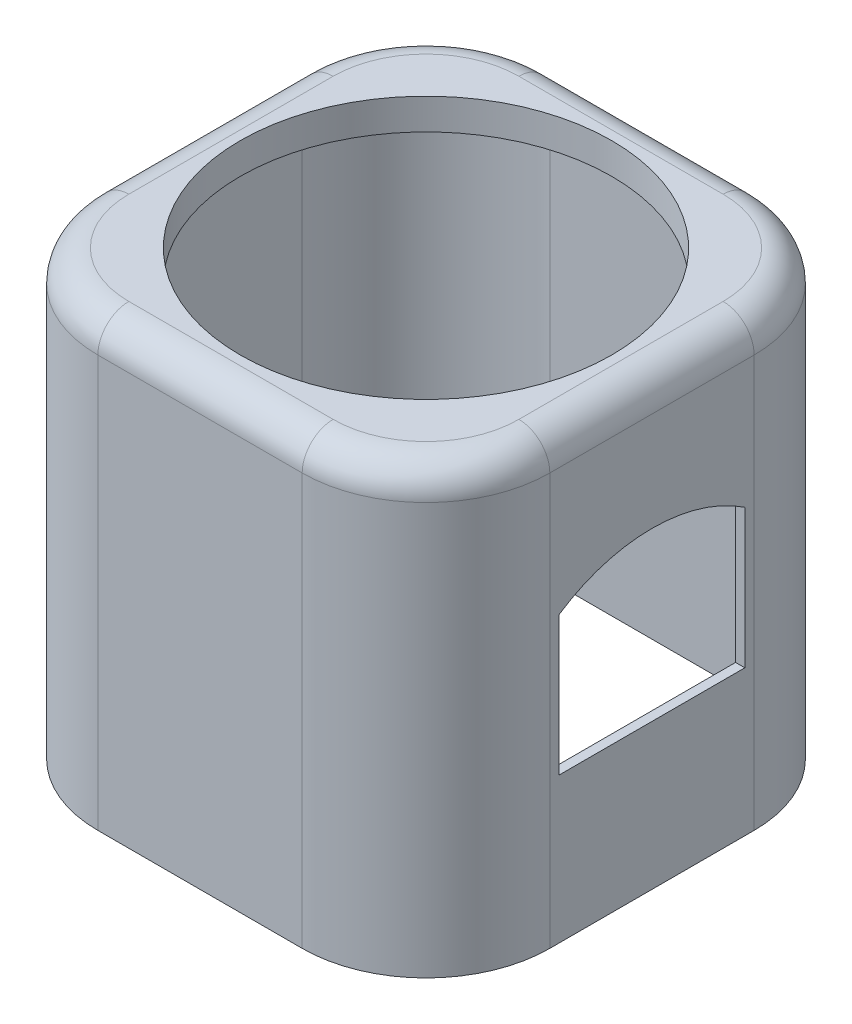
ISO-10303-21;
HEADER;
FILE_DESCRIPTION(('STEP AP214'),'2;1');
FILE_NAME('part.step','',(''),(''),'','','');
FILE_SCHEMA(('AUTOMOTIVE_DESIGN { 1 0 10303 214 1 1 1 1 }'));
ENDSEC;
DATA;
#1=APPLICATION_CONTEXT('core data for automotive mechanical design processes');
#2=APPLICATION_PROTOCOL_DEFINITION('international standard','automotive_design',2000,#1);
#3=PRODUCT_CONTEXT('',#1,'mechanical');
#4=PRODUCT('Part','Part','',(#3));
#5=PRODUCT_RELATED_PRODUCT_CATEGORY('part','',(#4));
#6=PRODUCT_DEFINITION_FORMATION('','',#4);
#7=PRODUCT_DEFINITION_CONTEXT('part definition',#1,'design');
#8=PRODUCT_DEFINITION('design','',#6,#7);
#9=PRODUCT_DEFINITION_SHAPE('','',#8);
#10=(LENGTH_UNIT() NAMED_UNIT(*) SI_UNIT(.MILLI.,.METRE.));
#11=(NAMED_UNIT(*) PLANE_ANGLE_UNIT() SI_UNIT($,.RADIAN.));
#12=(NAMED_UNIT(*) SI_UNIT($,.STERADIAN.) SOLID_ANGLE_UNIT());
#13=UNCERTAINTY_MEASURE_WITH_UNIT(LENGTH_MEASURE(1.E-05),#10,'distance_accuracy_value','');
#14=(GEOMETRIC_REPRESENTATION_CONTEXT(3) GLOBAL_UNCERTAINTY_ASSIGNED_CONTEXT((#13)) GLOBAL_UNIT_ASSIGNED_CONTEXT((#10,
#11,#12)) REPRESENTATION_CONTEXT('',''));
#15=CARTESIAN_POINT('',(0.,0.,0.));
#16=DIRECTION('',(0.,0.,1.));
#17=DIRECTION('',(1.,0.,0.));
#18=AXIS2_PLACEMENT_3D('',#15,#16,#17);
#19=CARTESIAN_POINT('',(73.,250.,-73.));
#20=DIRECTION('',(-1.,0.,0.));
#21=DIRECTION('',(0.,0.,1.));
#22=AXIS2_PLACEMENT_3D('',#19,#20,#21);
#23=PLANE('',#22);
#24=DIRECTION('',(0.,1.,0.));
#25=VECTOR('',#24,1.);
#26=CARTESIAN_POINT('',(73.,250.,33.));
#27=LINE('',#26,#25);
#28=CARTESIAN_POINT('',(73.,240.,33.));
#29=VERTEX_POINT('',#28);
#30=CARTESIAN_POINT('',(73.,107.,33.));
#31=VERTEX_POINT('',#30);
#32=EDGE_CURVE('E274',#29,#31,#27,.F.);
#33=ORIENTED_EDGE('',*,*,#32,.T.);
#34=DIRECTION('',(0.,0.,-1.));
#35=VECTOR('',#34,1.);
#36=CARTESIAN_POINT('',(73.,107.,-73.));
#37=LINE('',#36,#35);
#38=CARTESIAN_POINT('',(73.,107.,-33.));
#39=VERTEX_POINT('',#38);
#40=EDGE_CURVE('E402',#31,#39,#37,.T.);
#41=ORIENTED_EDGE('',*,*,#40,.T.);
#42=DIRECTION('',(0.,1.,0.));
#43=VECTOR('',#42,1.);
#44=CARTESIAN_POINT('',(73.,250.,-33.));
#45=LINE('',#44,#43);
#46=CARTESIAN_POINT('',(73.,240.,-33.));
#47=VERTEX_POINT('',#46);
#48=EDGE_CURVE('E278',#39,#47,#45,.T.);
#49=ORIENTED_EDGE('',*,*,#48,.T.);
#50=DIRECTION('',(0.,0.,-1.));
#51=VECTOR('',#50,1.);
#52=CARTESIAN_POINT('',(73.,240.,33.));
#53=LINE('',#52,#51);
#54=EDGE_CURVE('E318',#47,#29,#53,.F.);
#55=ORIENTED_EDGE('',*,*,#54,.T.);
#56=EDGE_LOOP('',(#33,#41,#49,#55));
#57=FACE_BOUND('',#56,.T.);
#58=DIRECTION('',(0.,0.,-1.));
#59=VECTOR('',#58,1.);
#60=CARTESIAN_POINT('',(73.,154.,-73.));
#61=LINE('',#60,#59);
#62=CARTESIAN_POINT('',(73.,154.,29.9999999999997));
#63=VERTEX_POINT('',#62);
#64=CARTESIAN_POINT('',(73.,154.,-29.9999999999997));
#65=VERTEX_POINT('',#64);
#66=EDGE_CURVE('E229',#63,#65,#61,.T.);
#67=ORIENTED_EDGE('',*,*,#66,.F.);
#68=DIRECTION('',(0.,1.,0.));
#69=VECTOR('',#68,1.);
#70=CARTESIAN_POINT('',(73.,250.,29.9999999999997));
#71=LINE('',#70,#69);
#72=CARTESIAN_POINT('',(73.,198.899888641287,29.9999999999997));
#73=VERTEX_POINT('',#72);
#74=EDGE_CURVE('E475',#63,#73,#71,.T.);
#75=ORIENTED_EDGE('',*,*,#74,.T.);
#76=CARTESIAN_POINT('',(73.,154.,0.));
#77=DIRECTION('',(-1.,0.,0.));
#78=DIRECTION('',(0.,0.,1.));
#79=AXIS2_PLACEMENT_3D('',#76,#77,#78);
#80=CIRCLE('',#79,54.);
#81=CARTESIAN_POINT('',(73.,198.899888641287,-29.9999999999997));
#82=VERTEX_POINT('',#81);
#83=EDGE_CURVE('E472',#73,#82,#80,.T.);
#84=ORIENTED_EDGE('',*,*,#83,.T.);
#85=DIRECTION('',(0.,-1.,0.));
#86=VECTOR('',#85,1.);
#87=CARTESIAN_POINT('',(73.,250.,-29.9999999999997));
#88=LINE('',#87,#86);
#89=EDGE_CURVE('E232',#82,#65,#88,.T.);
#90=ORIENTED_EDGE('',*,*,#89,.T.);
#91=EDGE_LOOP('',(#67,#75,#84,#90));
#92=FACE_BOUND('',#91,.T.);
#93=ADVANCED_FACE('F35',(#57,#92),#23,.F.);
#94=CARTESIAN_POINT('',(70.,240.,29.9999999999997));
#95=DIRECTION('',(1.,0.,0.));
#96=DIRECTION('',(0.,0.,-1.));
#97=AXIS2_PLACEMENT_3D('',#94,#95,#96);
#98=PLANE('',#97);
#99=DIRECTION('',(0.,0.,-1.));
#100=VECTOR('',#99,1.);
#101=CARTESIAN_POINT('',(70.,154.,29.9999999999997));
#102=LINE('',#101,#100);
#103=CARTESIAN_POINT('',(70.,154.,29.9999999999997));
#104=VERTEX_POINT('',#103);
#105=CARTESIAN_POINT('',(70.,154.,-29.9999999999997));
#106=VERTEX_POINT('',#105);
#107=EDGE_CURVE('E226',#104,#106,#102,.T.);
#108=ORIENTED_EDGE('',*,*,#107,.T.);
#109=DIRECTION('',(0.,-1.,0.));
#110=VECTOR('',#109,1.);
#111=CARTESIAN_POINT('',(70.,240.,-29.9999999999997));
#112=LINE('',#111,#110);
#113=CARTESIAN_POINT('',(70.,107.,-29.9999999999997));
#114=VERTEX_POINT('',#113);
#115=EDGE_CURVE('E245',#106,#114,#112,.T.);
#116=ORIENTED_EDGE('',*,*,#115,.T.);
#117=DIRECTION('',(0.,0.,1.));
#118=VECTOR('',#117,1.);
#119=CARTESIAN_POINT('',(70.,107.,29.9999999999997));
#120=LINE('',#119,#118);
#121=CARTESIAN_POINT('',(70.,107.,29.9999999999997));
#122=VERTEX_POINT('',#121);
#123=EDGE_CURVE('E446',#114,#122,#120,.T.);
#124=ORIENTED_EDGE('',*,*,#123,.T.);
#125=DIRECTION('',(0.,-1.,0.));
#126=VECTOR('',#125,1.);
#127=CARTESIAN_POINT('',(70.,240.,29.9999999999997));
#128=LINE('',#127,#126);
#129=EDGE_CURVE('E247',#104,#122,#128,.T.);
#130=ORIENTED_EDGE('',*,*,#129,.F.);
#131=EDGE_LOOP('',(#108,#116,#124,#130));
#132=FACE_BOUND('',#131,.T.);
#133=ADVANCED_FACE('F243',(#132),#98,.F.);
#134=CARTESIAN_POINT('',(-33.,250.,33.));
#135=DIRECTION('',(0.,1.,0.));
#136=DIRECTION('',(0.,0.,1.));
#137=AXIS2_PLACEMENT_3D('',#134,#135,#136);
#138=CYLINDRICAL_SURFACE('',#137,40.);
#139=CARTESIAN_POINT('',(-33.,107.,33.));
#140=DIRECTION('',(0.,1.,0.));
#141=DIRECTION('',(0.,0.,1.));
#142=AXIS2_PLACEMENT_3D('',#139,#140,#141);
#143=CIRCLE('',#142,40.);
#144=CARTESIAN_POINT('',(-33.,107.,73.));
#145=VERTEX_POINT('',#144);
#146=CARTESIAN_POINT('',(-73.,107.,33.));
#147=VERTEX_POINT('',#146);
#148=EDGE_CURVE('E410',#145,#147,#143,.F.);
#149=ORIENTED_EDGE('',*,*,#148,.F.);
#150=DIRECTION('',(0.,1.,0.));
#151=VECTOR('',#150,1.);
#152=CARTESIAN_POINT('',(-33.,250.,73.));
#153=LINE('',#152,#151);
#154=CARTESIAN_POINT('',(-33.,240.,73.));
#155=VERTEX_POINT('',#154);
#156=EDGE_CURVE('E290',#155,#145,#153,.F.);
#157=ORIENTED_EDGE('',*,*,#156,.F.);
#158=CARTESIAN_POINT('',(-33.,240.,33.));
#159=DIRECTION('',(0.,1.,0.));
#160=DIRECTION('',(0.,0.,1.));
#161=AXIS2_PLACEMENT_3D('',#158,#159,#160);
#162=CIRCLE('',#161,40.);
#163=CARTESIAN_POINT('',(-73.,240.,33.));
#164=VERTEX_POINT('',#163);
#165=EDGE_CURVE('E325',#155,#164,#162,.F.);
#166=ORIENTED_EDGE('',*,*,#165,.T.);
#167=DIRECTION('',(0.,1.,0.));
#168=VECTOR('',#167,1.);
#169=CARTESIAN_POINT('',(-73.,250.,33.));
#170=LINE('',#169,#168);
#171=EDGE_CURVE('E288',#147,#164,#170,.T.);
#172=ORIENTED_EDGE('',*,*,#171,.F.);
#173=EDGE_LOOP('',(#149,#157,#166,#172));
#174=FACE_BOUND('',#173,.T.);
#175=ADVANCED_FACE('F567',(#174),#138,.T.);
#176=CARTESIAN_POINT('',(-33.,250.,-33.));
#177=DIRECTION('',(0.,1.,0.));
#178=DIRECTION('',(0.,0.,1.));
#179=AXIS2_PLACEMENT_3D('',#176,#177,#178);
#180=CYLINDRICAL_SURFACE('',#179,40.);
#181=CARTESIAN_POINT('',(-33.,107.,-33.));
#182=DIRECTION('',(0.,1.,0.));
#183=DIRECTION('',(0.,0.,1.));
#184=AXIS2_PLACEMENT_3D('',#181,#182,#183);
#185=CIRCLE('',#184,40.);
#186=CARTESIAN_POINT('',(-73.,107.,-33.));
#187=VERTEX_POINT('',#186);
#188=CARTESIAN_POINT('',(-33.,107.,-73.));
#189=VERTEX_POINT('',#188);
#190=EDGE_CURVE('E400',#187,#189,#185,.F.);
#191=ORIENTED_EDGE('',*,*,#190,.F.);
#192=DIRECTION('',(0.,1.,0.));
#193=VECTOR('',#192,1.);
#194=CARTESIAN_POINT('',(-73.,250.,-33.));
#195=LINE('',#194,#193);
#196=CARTESIAN_POINT('',(-73.,240.,-33.));
#197=VERTEX_POINT('',#196);
#198=EDGE_CURVE('E285',#197,#187,#195,.F.);
#199=ORIENTED_EDGE('',*,*,#198,.F.);
#200=CARTESIAN_POINT('',(-33.,240.,-33.));
#201=DIRECTION('',(0.,1.,0.));
#202=DIRECTION('',(0.,0.,1.));
#203=AXIS2_PLACEMENT_3D('',#200,#201,#202);
#204=CIRCLE('',#203,40.);
#205=CARTESIAN_POINT('',(-33.,240.,-73.));
#206=VERTEX_POINT('',#205);
#207=EDGE_CURVE('E310',#197,#206,#204,.F.);
#208=ORIENTED_EDGE('',*,*,#207,.T.);
#209=DIRECTION('',(0.,1.,0.));
#210=VECTOR('',#209,1.);
#211=CARTESIAN_POINT('',(-33.,250.,-73.));
#212=LINE('',#211,#210);
#213=EDGE_CURVE('E283',#189,#206,#212,.T.);
#214=ORIENTED_EDGE('',*,*,#213,.F.);
#215=EDGE_LOOP('',(#191,#199,#208,#214));
#216=FACE_BOUND('',#215,.T.);
#217=ADVANCED_FACE('F509',(#216),#180,.T.);
#218=CARTESIAN_POINT('',(33.,250.,-33.));
#219=DIRECTION('',(0.,1.,0.));
#220=DIRECTION('',(0.,0.,1.));
#221=AXIS2_PLACEMENT_3D('',#218,#219,#220);
#222=CYLINDRICAL_SURFACE('',#221,40.);
#223=CARTESIAN_POINT('',(33.,107.,-33.));
#224=DIRECTION('',(0.,1.,0.));
#225=DIRECTION('',(0.,0.,1.));
#226=AXIS2_PLACEMENT_3D('',#223,#224,#225);
#227=CIRCLE('',#226,40.);
#228=CARTESIAN_POINT('',(33.,107.,-73.));
#229=VERTEX_POINT('',#228);
#230=EDGE_CURVE('E393',#229,#39,#227,.F.);
#231=ORIENTED_EDGE('',*,*,#230,.F.);
#232=DIRECTION('',(0.,1.,0.));
#233=VECTOR('',#232,1.);
#234=CARTESIAN_POINT('',(33.,250.,-73.));
#235=LINE('',#234,#233);
#236=CARTESIAN_POINT('',(33.,240.,-73.));
#237=VERTEX_POINT('',#236);
#238=EDGE_CURVE('E280',#237,#229,#235,.F.);
#239=ORIENTED_EDGE('',*,*,#238,.F.);
#240=CARTESIAN_POINT('',(33.,240.,-33.));
#241=DIRECTION('',(0.,1.,0.));
#242=DIRECTION('',(0.,0.,1.));
#243=AXIS2_PLACEMENT_3D('',#240,#241,#242);
#244=CIRCLE('',#243,40.);
#245=EDGE_CURVE('E315',#237,#47,#244,.F.);
#246=ORIENTED_EDGE('',*,*,#245,.T.);
#247=ORIENTED_EDGE('',*,*,#48,.F.);
#248=EDGE_LOOP('',(#231,#239,#246,#247));
#249=FACE_BOUND('',#248,.T.);
#250=ADVANCED_FACE('F535',(#249),#222,.T.);
#251=CARTESIAN_POINT('',(33.,250.,33.));
#252=DIRECTION('',(0.,1.,0.));
#253=DIRECTION('',(0.,0.,1.));
#254=AXIS2_PLACEMENT_3D('',#251,#252,#253);
#255=CYLINDRICAL_SURFACE('',#254,40.);
#256=CARTESIAN_POINT('',(33.,107.,33.));
#257=DIRECTION('',(0.,1.,0.));
#258=DIRECTION('',(0.,0.,1.));
#259=AXIS2_PLACEMENT_3D('',#256,#257,#258);
#260=CIRCLE('',#259,40.);
#261=CARTESIAN_POINT('',(33.,107.,73.));
#262=VERTEX_POINT('',#261);
#263=EDGE_CURVE('E408',#31,#262,#260,.F.);
#264=ORIENTED_EDGE('',*,*,#263,.F.);
#265=ORIENTED_EDGE('',*,*,#32,.F.);
#266=CARTESIAN_POINT('',(33.,240.,33.));
#267=DIRECTION('',(0.,1.,0.));
#268=DIRECTION('',(0.,0.,1.));
#269=AXIS2_PLACEMENT_3D('',#266,#267,#268);
#270=CIRCLE('',#269,40.);
#271=CARTESIAN_POINT('',(33.,240.,73.));
#272=VERTEX_POINT('',#271);
#273=EDGE_CURVE('E320',#29,#272,#270,.F.);
#274=ORIENTED_EDGE('',*,*,#273,.T.);
#275=DIRECTION('',(0.,1.,0.));
#276=VECTOR('',#275,1.);
#277=CARTESIAN_POINT('',(33.,250.,73.));
#278=LINE('',#277,#276);
#279=EDGE_CURVE('E272',#262,#272,#278,.T.);
#280=ORIENTED_EDGE('',*,*,#279,.F.);
#281=EDGE_LOOP('',(#264,#265,#274,#280));
#282=FACE_BOUND('',#281,.T.);
#283=ADVANCED_FACE('F551',(#282),#255,.T.);
#284=CARTESIAN_POINT('',(-73.,250.,-73.));
#285=DIRECTION('',(1.,0.,0.));
#286=DIRECTION('',(0.,0.,-1.));
#287=AXIS2_PLACEMENT_3D('',#284,#285,#286);
#288=PLANE('',#287);
#289=DIRECTION('',(0.,0.,-1.));
#290=VECTOR('',#289,1.);
#291=CARTESIAN_POINT('',(-73.,120.,-16.));
#292=LINE('',#291,#290);
#293=CARTESIAN_POINT('',(-73.,120.,16.));
#294=VERTEX_POINT('',#293);
#295=CARTESIAN_POINT('',(-73.,120.,-16.));
#296=VERTEX_POINT('',#295);
#297=EDGE_CURVE('E466',#294,#296,#292,.T.);
#298=ORIENTED_EDGE('',*,*,#297,.F.);
#299=DIRECTION('',(0.,1.,0.));
#300=VECTOR('',#299,1.);
#301=CARTESIAN_POINT('',(-73.,120.,16.));
#302=LINE('',#301,#300);
#303=CARTESIAN_POINT('',(-73.,107.,16.));
#304=VERTEX_POINT('',#303);
#305=EDGE_CURVE('E469',#304,#294,#302,.T.);
#306=ORIENTED_EDGE('',*,*,#305,.F.);
#307=DIRECTION('',(0.,0.,1.));
#308=VECTOR('',#307,1.);
#309=CARTESIAN_POINT('',(-73.,107.,-73.));
#310=LINE('',#309,#308);
#311=EDGE_CURVE('E370',#304,#147,#310,.T.);
#312=ORIENTED_EDGE('',*,*,#311,.T.);
#313=ORIENTED_EDGE('',*,*,#171,.T.);
#314=DIRECTION('',(0.,0.,1.));
#315=VECTOR('',#314,1.);
#316=CARTESIAN_POINT('',(-73.,240.,-33.));
#317=LINE('',#316,#315);
#318=EDGE_CURVE('E328',#164,#197,#317,.F.);
#319=ORIENTED_EDGE('',*,*,#318,.T.);
#320=ORIENTED_EDGE('',*,*,#198,.T.);
#321=CARTESIAN_POINT('',(-73.,107.,-16.));
#322=VERTEX_POINT('',#321);
#323=EDGE_CURVE('E405',#187,#322,#310,.T.);
#324=ORIENTED_EDGE('',*,*,#323,.T.);
#325=DIRECTION('',(0.,-1.,0.));
#326=VECTOR('',#325,1.);
#327=CARTESIAN_POINT('',(-73.,107.,-16.));
#328=LINE('',#327,#326);
#329=EDGE_CURVE('E463',#296,#322,#328,.T.);
#330=ORIENTED_EDGE('',*,*,#329,.F.);
#331=EDGE_LOOP('',(#298,#306,#312,#313,#319,#320,#324,#330));
#332=FACE_BOUND('',#331,.T.);
#333=ADVANCED_FACE('F504',(#332),#288,.F.);
#334=CARTESIAN_POINT('',(-73.,250.,73.));
#335=DIRECTION('',(0.,0.,-1.));
#336=DIRECTION('',(-1.,0.,0.));
#337=AXIS2_PLACEMENT_3D('',#334,#335,#336);
#338=PLANE('',#337);
#339=ORIENTED_EDGE('',*,*,#156,.T.);
#340=DIRECTION('',(1.,0.,0.));
#341=VECTOR('',#340,1.);
#342=CARTESIAN_POINT('',(-73.,107.,73.));
#343=LINE('',#342,#341);
#344=EDGE_CURVE('E412',#145,#262,#343,.T.);
#345=ORIENTED_EDGE('',*,*,#344,.T.);
#346=ORIENTED_EDGE('',*,*,#279,.T.);
#347=DIRECTION('',(1.,0.,0.));
#348=VECTOR('',#347,1.);
#349=CARTESIAN_POINT('',(-33.,240.,73.));
#350=LINE('',#349,#348);
#351=EDGE_CURVE('E323',#272,#155,#350,.F.);
#352=ORIENTED_EDGE('',*,*,#351,.T.);
#353=EDGE_LOOP('',(#339,#345,#346,#352));
#354=FACE_BOUND('',#353,.T.);
#355=ADVANCED_FACE('F564',(#354),#338,.F.);
#356=CARTESIAN_POINT('',(-73.,250.,-73.));
#357=DIRECTION('',(0.,0.,1.));
#358=DIRECTION('',(1.,0.,0.));
#359=AXIS2_PLACEMENT_3D('',#356,#357,#358);
#360=PLANE('',#359);
#361=ORIENTED_EDGE('',*,*,#238,.T.);
#362=DIRECTION('',(-1.,0.,0.));
#363=VECTOR('',#362,1.);
#364=CARTESIAN_POINT('',(-73.,107.,-73.));
#365=LINE('',#364,#363);
#366=EDGE_CURVE('E389',#229,#189,#365,.T.);
#367=ORIENTED_EDGE('',*,*,#366,.T.);
#368=ORIENTED_EDGE('',*,*,#213,.T.);
#369=DIRECTION('',(-1.,0.,0.));
#370=VECTOR('',#369,1.);
#371=CARTESIAN_POINT('',(33.,240.,-73.));
#372=LINE('',#371,#370);
#373=EDGE_CURVE('E313',#206,#237,#372,.F.);
#374=ORIENTED_EDGE('',*,*,#373,.T.);
#375=EDGE_LOOP('',(#361,#367,#368,#374));
#376=FACE_BOUND('',#375,.T.);
#377=ADVANCED_FACE('F531',(#376),#360,.F.);
#378=CARTESIAN_POINT('',(0.,250.,0.));
#379=DIRECTION('',(0.,1.,0.));
#380=DIRECTION('',(0.,0.,1.));
#381=AXIS2_PLACEMENT_3D('',#378,#379,#380);
#382=PLANE('',#381);
#383=CARTESIAN_POINT('',(0.,250.,0.));
#384=DIRECTION('',(0.,1.,0.));
#385=DIRECTION('',(0.,0.,1.));
#386=AXIS2_PLACEMENT_3D('',#383,#384,#385);
#387=CIRCLE('',#386,60.);
#388=CARTESIAN_POINT('',(0.,250.,60.));
#389=VERTEX_POINT('',#388);
#390=EDGE_CURVE('E358',#389,#389,#387,.T.);
#391=ORIENTED_EDGE('',*,*,#390,.F.);
#392=EDGE_LOOP('',(#391));
#393=FACE_BOUND('',#392,.T.);
#394=DIRECTION('',(-1.,0.,0.));
#395=VECTOR('',#394,1.);
#396=CARTESIAN_POINT('',(-33.,250.,-63.));
#397=LINE('',#396,#395);
#398=CARTESIAN_POINT('',(33.,250.,-63.));
#399=VERTEX_POINT('',#398);
#400=CARTESIAN_POINT('',(-33.,250.,-63.));
#401=VERTEX_POINT('',#400);
#402=EDGE_CURVE('E305',#399,#401,#397,.T.);
#403=ORIENTED_EDGE('',*,*,#402,.T.);
#404=CARTESIAN_POINT('',(-33.,250.,-33.));
#405=DIRECTION('',(0.,1.,0.));
#406=DIRECTION('',(0.,0.,1.));
#407=AXIS2_PLACEMENT_3D('',#404,#405,#406);
#408=CIRCLE('',#407,30.);
#409=CARTESIAN_POINT('',(-63.,250.,-33.));
#410=VERTEX_POINT('',#409);
#411=EDGE_CURVE('E307',#401,#410,#408,.T.);
#412=ORIENTED_EDGE('',*,*,#411,.T.);
#413=DIRECTION('',(0.,0.,1.));
#414=VECTOR('',#413,1.);
#415=CARTESIAN_POINT('',(-63.,250.,33.));
#416=LINE('',#415,#414);
#417=CARTESIAN_POINT('',(-63.,250.,33.));
#418=VERTEX_POINT('',#417);
#419=EDGE_CURVE('E293',#410,#418,#416,.T.);
#420=ORIENTED_EDGE('',*,*,#419,.T.);
#421=CARTESIAN_POINT('',(-33.,250.,33.));
#422=DIRECTION('',(0.,1.,0.));
#423=DIRECTION('',(0.,0.,1.));
#424=AXIS2_PLACEMENT_3D('',#421,#422,#423);
#425=CIRCLE('',#424,30.);
#426=CARTESIAN_POINT('',(-33.,250.,63.));
#427=VERTEX_POINT('',#426);
#428=EDGE_CURVE('E295',#418,#427,#425,.T.);
#429=ORIENTED_EDGE('',*,*,#428,.T.);
#430=DIRECTION('',(1.,0.,0.));
#431=VECTOR('',#430,1.);
#432=CARTESIAN_POINT('',(33.,250.,63.));
#433=LINE('',#432,#431);
#434=CARTESIAN_POINT('',(33.,250.,63.));
#435=VERTEX_POINT('',#434);
#436=EDGE_CURVE('E297',#427,#435,#433,.T.);
#437=ORIENTED_EDGE('',*,*,#436,.T.);
#438=CARTESIAN_POINT('',(33.,250.,33.));
#439=DIRECTION('',(0.,1.,0.));
#440=DIRECTION('',(0.,0.,1.));
#441=AXIS2_PLACEMENT_3D('',#438,#439,#440);
#442=CIRCLE('',#441,30.);
#443=CARTESIAN_POINT('',(63.,250.,33.));
#444=VERTEX_POINT('',#443);
#445=EDGE_CURVE('E299',#435,#444,#442,.T.);
#446=ORIENTED_EDGE('',*,*,#445,.T.);
#447=DIRECTION('',(0.,0.,-1.));
#448=VECTOR('',#447,1.);
#449=CARTESIAN_POINT('',(63.,250.,-33.));
#450=LINE('',#449,#448);
#451=CARTESIAN_POINT('',(63.,250.,-33.));
#452=VERTEX_POINT('',#451);
#453=EDGE_CURVE('E301',#444,#452,#450,.T.);
#454=ORIENTED_EDGE('',*,*,#453,.T.);
#455=CARTESIAN_POINT('',(33.,250.,-33.));
#456=DIRECTION('',(0.,1.,0.));
#457=DIRECTION('',(0.,0.,1.));
#458=AXIS2_PLACEMENT_3D('',#455,#456,#457);
#459=CIRCLE('',#458,30.);
#460=EDGE_CURVE('E303',#452,#399,#459,.T.);
#461=ORIENTED_EDGE('',*,*,#460,.T.);
#462=EDGE_LOOP('',(#403,#412,#420,#429,#437,#446,#454,#461));
#463=FACE_BOUND('',#462,.T.);
#464=ADVANCED_FACE('F523',(#393,#463),#382,.T.);
#465=CARTESIAN_POINT('',(33.,240.,33.));
#466=DIRECTION('',(0.,1.,0.));
#467=DIRECTION('',(0.,0.,1.));
#468=AXIS2_PLACEMENT_3D('',#465,#466,#467);
#469=TOROIDAL_SURFACE('',#468,30.,10.);
#470=CARTESIAN_POINT('',(33.,240.,63.));
#471=DIRECTION('',(-1.,0.,0.));
#472=DIRECTION('',(0.,0.,1.));
#473=AXIS2_PLACEMENT_3D('',#470,#471,#472);
#474=CIRCLE('',#473,10.);
#475=EDGE_CURVE('E349',#272,#435,#474,.T.);
#476=ORIENTED_EDGE('',*,*,#475,.F.);
#477=ORIENTED_EDGE('',*,*,#273,.F.);
#478=CARTESIAN_POINT('',(63.,240.,33.));
#479=DIRECTION('',(0.,0.,-1.));
#480=DIRECTION('',(-1.,0.,0.));
#481=AXIS2_PLACEMENT_3D('',#478,#479,#480);
#482=CIRCLE('',#481,10.);
#483=EDGE_CURVE('E275',#444,#29,#482,.T.);
#484=ORIENTED_EDGE('',*,*,#483,.F.);
#485=ORIENTED_EDGE('',*,*,#445,.F.);
#486=EDGE_LOOP('',(#476,#477,#484,#485));
#487=FACE_BOUND('',#486,.T.);
#488=ADVANCED_FACE('F37',(#487),#469,.T.);
#489=CARTESIAN_POINT('',(63.,240.,0.));
#490=DIRECTION('',(0.,0.,1.));
#491=DIRECTION('',(1.,0.,0.));
#492=AXIS2_PLACEMENT_3D('',#489,#490,#491);
#493=CYLINDRICAL_SURFACE('',#492,10.);
#494=ORIENTED_EDGE('',*,*,#483,.T.);
#495=ORIENTED_EDGE('',*,*,#54,.F.);
#496=CARTESIAN_POINT('',(63.,240.,-33.));
#497=DIRECTION('',(0.,0.,-1.));
#498=DIRECTION('',(-1.,0.,0.));
#499=AXIS2_PLACEMENT_3D('',#496,#497,#498);
#500=CIRCLE('',#499,10.);
#501=EDGE_CURVE('E346',#452,#47,#500,.T.);
#502=ORIENTED_EDGE('',*,*,#501,.F.);
#503=ORIENTED_EDGE('',*,*,#453,.F.);
#504=EDGE_LOOP('',(#494,#495,#502,#503));
#505=FACE_BOUND('',#504,.T.);
#506=ADVANCED_FACE('F543',(#505),#493,.T.);
#507=CARTESIAN_POINT('',(0.,240.,63.));
#508=DIRECTION('',(-1.,0.,0.));
#509=DIRECTION('',(0.,0.,1.));
#510=AXIS2_PLACEMENT_3D('',#507,#508,#509);
#511=CYLINDRICAL_SURFACE('',#510,10.);
#512=ORIENTED_EDGE('',*,*,#475,.T.);
#513=ORIENTED_EDGE('',*,*,#436,.F.);
#514=CARTESIAN_POINT('',(-33.,240.,63.));
#515=DIRECTION('',(-1.,0.,0.));
#516=DIRECTION('',(0.,0.,1.));
#517=AXIS2_PLACEMENT_3D('',#514,#515,#516);
#518=CIRCLE('',#517,10.);
#519=EDGE_CURVE('E343',#155,#427,#518,.T.);
#520=ORIENTED_EDGE('',*,*,#519,.F.);
#521=ORIENTED_EDGE('',*,*,#351,.F.);
#522=EDGE_LOOP('',(#512,#513,#520,#521));
#523=FACE_BOUND('',#522,.T.);
#524=ADVANCED_FACE('F560',(#523),#511,.T.);
#525=CARTESIAN_POINT('',(33.,240.,-33.));
#526=DIRECTION('',(0.,1.,0.));
#527=DIRECTION('',(0.,0.,1.));
#528=AXIS2_PLACEMENT_3D('',#525,#526,#527);
#529=TOROIDAL_SURFACE('',#528,30.,10.);
#530=ORIENTED_EDGE('',*,*,#501,.T.);
#531=ORIENTED_EDGE('',*,*,#245,.F.);
#532=CARTESIAN_POINT('',(33.,240.,-63.));
#533=DIRECTION('',(-1.,0.,0.));
#534=DIRECTION('',(0.,0.,1.));
#535=AXIS2_PLACEMENT_3D('',#532,#533,#534);
#536=CIRCLE('',#535,10.);
#537=EDGE_CURVE('E340',#399,#237,#536,.T.);
#538=ORIENTED_EDGE('',*,*,#537,.F.);
#539=ORIENTED_EDGE('',*,*,#460,.F.);
#540=EDGE_LOOP('',(#530,#531,#538,#539));
#541=FACE_BOUND('',#540,.T.);
#542=ADVANCED_FACE('F539',(#541),#529,.T.);
#543=CARTESIAN_POINT('',(-33.,240.,33.));
#544=DIRECTION('',(0.,1.,0.));
#545=DIRECTION('',(0.,0.,1.));
#546=AXIS2_PLACEMENT_3D('',#543,#544,#545);
#547=TOROIDAL_SURFACE('',#546,30.,10.);
#548=ORIENTED_EDGE('',*,*,#519,.T.);
#549=ORIENTED_EDGE('',*,*,#428,.F.);
#550=CARTESIAN_POINT('',(-63.,240.,33.));
#551=DIRECTION('',(0.,0.,-1.));
#552=DIRECTION('',(-1.,0.,0.));
#553=AXIS2_PLACEMENT_3D('',#550,#551,#552);
#554=CIRCLE('',#553,10.);
#555=EDGE_CURVE('E337',#164,#418,#554,.T.);
#556=ORIENTED_EDGE('',*,*,#555,.F.);
#557=ORIENTED_EDGE('',*,*,#165,.F.);
#558=EDGE_LOOP('',(#548,#549,#556,#557));
#559=FACE_BOUND('',#558,.T.);
#560=ADVANCED_FACE('F612',(#559),#547,.T.);
#561=CARTESIAN_POINT('',(0.,240.,-63.));
#562=DIRECTION('',(1.,0.,0.));
#563=DIRECTION('',(0.,0.,-1.));
#564=AXIS2_PLACEMENT_3D('',#561,#562,#563);
#565=CYLINDRICAL_SURFACE('',#564,10.);
#566=ORIENTED_EDGE('',*,*,#537,.T.);
#567=ORIENTED_EDGE('',*,*,#373,.F.);
#568=CARTESIAN_POINT('',(-33.,240.,-63.));
#569=DIRECTION('',(-1.,0.,0.));
#570=DIRECTION('',(0.,0.,1.));
#571=AXIS2_PLACEMENT_3D('',#568,#569,#570);
#572=CIRCLE('',#571,10.);
#573=EDGE_CURVE('E333',#401,#206,#572,.T.);
#574=ORIENTED_EDGE('',*,*,#573,.F.);
#575=ORIENTED_EDGE('',*,*,#402,.F.);
#576=EDGE_LOOP('',(#566,#567,#574,#575));
#577=FACE_BOUND('',#576,.T.);
#578=ADVANCED_FACE('F528',(#577),#565,.T.);
#579=CARTESIAN_POINT('',(-63.,240.,0.));
#580=DIRECTION('',(0.,0.,-1.));
#581=DIRECTION('',(-1.,0.,0.));
#582=AXIS2_PLACEMENT_3D('',#579,#580,#581);
#583=CYLINDRICAL_SURFACE('',#582,10.);
#584=ORIENTED_EDGE('',*,*,#555,.T.);
#585=ORIENTED_EDGE('',*,*,#419,.F.);
#586=CARTESIAN_POINT('',(-63.,240.,-33.));
#587=DIRECTION('',(0.,0.,-1.));
#588=DIRECTION('',(-1.,0.,0.));
#589=AXIS2_PLACEMENT_3D('',#586,#587,#588);
#590=CIRCLE('',#589,10.);
#591=EDGE_CURVE('E331',#197,#410,#590,.T.);
#592=ORIENTED_EDGE('',*,*,#591,.F.);
#593=ORIENTED_EDGE('',*,*,#318,.F.);
#594=EDGE_LOOP('',(#584,#585,#592,#593));
#595=FACE_BOUND('',#594,.T.);
#596=ADVANCED_FACE('F519',(#595),#583,.T.);
#597=CARTESIAN_POINT('',(-33.,240.,-33.));
#598=DIRECTION('',(0.,1.,0.));
#599=DIRECTION('',(0.,0.,1.));
#600=AXIS2_PLACEMENT_3D('',#597,#598,#599);
#601=TOROIDAL_SURFACE('',#600,30.,10.);
#602=ORIENTED_EDGE('',*,*,#573,.T.);
#603=ORIENTED_EDGE('',*,*,#207,.F.);
#604=ORIENTED_EDGE('',*,*,#591,.T.);
#605=ORIENTED_EDGE('',*,*,#411,.F.);
#606=EDGE_LOOP('',(#602,#603,#604,#605));
#607=FACE_BOUND('',#606,.T.);
#608=ADVANCED_FACE('F513',(#607),#601,.T.);
#609=CARTESIAN_POINT('',(-30.,240.,30.));
#610=DIRECTION('',(0.,-1.,0.));
#611=DIRECTION('',(0.,0.,-1.));
#612=AXIS2_PLACEMENT_3D('',#609,#610,#611);
#613=CYLINDRICAL_SURFACE('',#612,40.);
#614=DIRECTION('',(0.,-1.,0.));
#615=VECTOR('',#614,1.);
#616=CARTESIAN_POINT('',(-29.9999999999997,240.,70.));
#617=LINE('',#616,#615);
#618=CARTESIAN_POINT('',(-29.9999999999997,240.,70.));
#619=VERTEX_POINT('',#618);
#620=CARTESIAN_POINT('',(-29.9999999999997,107.,70.));
#621=VERTEX_POINT('',#620);
#622=EDGE_CURVE('E334',#619,#621,#617,.T.);
#623=ORIENTED_EDGE('',*,*,#622,.T.);
#624=CARTESIAN_POINT('',(-30.,107.,30.));
#625=DIRECTION('',(0.,1.,0.));
#626=DIRECTION('',(0.,0.,1.));
#627=AXIS2_PLACEMENT_3D('',#624,#625,#626);
#628=CIRCLE('',#627,40.);
#629=CARTESIAN_POINT('',(-70.,107.,29.9999999999997));
#630=VERTEX_POINT('',#629);
#631=EDGE_CURVE('E387',#621,#630,#628,.F.);
#632=ORIENTED_EDGE('',*,*,#631,.T.);
#633=DIRECTION('',(0.,-1.,0.));
#634=VECTOR('',#633,1.);
#635=CARTESIAN_POINT('',(-70.,240.,29.9999999999997));
#636=LINE('',#635,#634);
#637=CARTESIAN_POINT('',(-70.,240.,29.9999999999997));
#638=VERTEX_POINT('',#637);
#639=EDGE_CURVE('E268',#638,#630,#636,.T.);
#640=ORIENTED_EDGE('',*,*,#639,.F.);
#641=CARTESIAN_POINT('',(-30.,240.,30.));
#642=DIRECTION('',(0.,-1.,0.));
#643=DIRECTION('',(0.,0.,-1.));
#644=AXIS2_PLACEMENT_3D('',#641,#642,#643);
#645=CIRCLE('',#644,40.);
#646=EDGE_CURVE('E357',#619,#638,#645,.T.);
#647=ORIENTED_EDGE('',*,*,#646,.F.);
#648=EDGE_LOOP('',(#623,#632,#640,#647));
#649=FACE_BOUND('',#648,.T.);
#650=ADVANCED_FACE('F385',(#649),#613,.F.);
#651=CARTESIAN_POINT('',(-29.9999999999997,240.,70.));
#652=DIRECTION('',(0.,0.,1.));
#653=DIRECTION('',(1.,0.,0.));
#654=AXIS2_PLACEMENT_3D('',#651,#652,#653);
#655=PLANE('',#654);
#656=DIRECTION('',(0.,-1.,0.));
#657=VECTOR('',#656,1.);
#658=CARTESIAN_POINT('',(29.9999999999997,240.,70.));
#659=LINE('',#658,#657);
#660=CARTESIAN_POINT('',(29.9999999999997,240.,70.));
#661=VERTEX_POINT('',#660);
#662=CARTESIAN_POINT('',(30.,107.,70.));
#663=VERTEX_POINT('',#662);
#664=EDGE_CURVE('E435',#661,#663,#659,.T.);
#665=ORIENTED_EDGE('',*,*,#664,.T.);
#666=DIRECTION('',(-1.,0.,0.));
#667=VECTOR('',#666,1.);
#668=CARTESIAN_POINT('',(-29.9999999999997,107.,70.));
#669=LINE('',#668,#667);
#670=EDGE_CURVE('E390',#663,#621,#669,.T.);
#671=ORIENTED_EDGE('',*,*,#670,.T.);
#672=ORIENTED_EDGE('',*,*,#622,.F.);
#673=DIRECTION('',(-1.,0.,0.));
#674=VECTOR('',#673,1.);
#675=CARTESIAN_POINT('',(-29.9999999999997,240.,70.));
#676=LINE('',#675,#674);
#677=EDGE_CURVE('E271',#661,#619,#676,.T.);
#678=ORIENTED_EDGE('',*,*,#677,.F.);
#679=EDGE_LOOP('',(#665,#671,#672,#678));
#680=FACE_BOUND('',#679,.T.);
#681=ADVANCED_FACE('F635',(#680),#655,.F.);
#682=CARTESIAN_POINT('',(30.,240.,30.));
#683=DIRECTION('',(0.,-1.,0.));
#684=DIRECTION('',(0.,0.,-1.));
#685=AXIS2_PLACEMENT_3D('',#682,#683,#684);
#686=CYLINDRICAL_SURFACE('',#685,40.);
#687=CARTESIAN_POINT('',(70.,240.,29.9999999999997));
#688=VERTEX_POINT('',#687);
#689=CARTESIAN_POINT('',(70.,198.899888641287,29.9999999999997));
#690=VERTEX_POINT('',#689);
#691=EDGE_CURVE('E260',#688,#690,#128,.T.);
#692=ORIENTED_EDGE('',*,*,#691,.T.);
#693=DIRECTION('',(0.,1.,0.));
#694=VECTOR('',#693,1.);
#695=CARTESIAN_POINT('',(70.,154.,29.9999999999997));
#696=LINE('',#695,#694);
#697=EDGE_CURVE('E445',#104,#690,#696,.T.);
#698=ORIENTED_EDGE('',*,*,#697,.F.);
#699=ORIENTED_EDGE('',*,*,#129,.T.);
#700=CARTESIAN_POINT('',(30.,107.,30.));
#701=DIRECTION('',(0.,1.,0.));
#702=DIRECTION('',(0.,0.,1.));
#703=AXIS2_PLACEMENT_3D('',#700,#701,#702);
#704=CIRCLE('',#703,40.);
#705=EDGE_CURVE('E395',#122,#663,#704,.F.);
#706=ORIENTED_EDGE('',*,*,#705,.T.);
#707=ORIENTED_EDGE('',*,*,#664,.F.);
#708=CARTESIAN_POINT('',(30.,240.,30.));
#709=DIRECTION('',(0.,-1.,0.));
#710=DIRECTION('',(0.,0.,-1.));
#711=AXIS2_PLACEMENT_3D('',#708,#709,#710);
#712=CIRCLE('',#711,40.);
#713=EDGE_CURVE('E431',#688,#661,#712,.T.);
#714=ORIENTED_EDGE('',*,*,#713,.F.);
#715=EDGE_LOOP('',(#692,#698,#699,#706,#707,#714));
#716=FACE_BOUND('',#715,.T.);
#717=ADVANCED_FACE('F444',(#716),#686,.F.);
#718=CARTESIAN_POINT('',(70.,240.,-29.9999999999997));
#719=VERTEX_POINT('',#718);
#720=CARTESIAN_POINT('',(70.,198.899888641287,-29.9999999999997));
#721=VERTEX_POINT('',#720);
#722=EDGE_CURVE('E254',#719,#721,#112,.T.);
#723=ORIENTED_EDGE('',*,*,#722,.T.);
#724=CARTESIAN_POINT('',(70.,154.,0.));
#725=DIRECTION('',(-1.,0.,0.));
#726=DIRECTION('',(0.,0.,1.));
#727=AXIS2_PLACEMENT_3D('',#724,#725,#726);
#728=CIRCLE('',#727,54.);
#729=EDGE_CURVE('E57',#690,#721,#728,.T.);
#730=ORIENTED_EDGE('',*,*,#729,.F.);
#731=ORIENTED_EDGE('',*,*,#691,.F.);
#732=DIRECTION('',(0.,0.,1.));
#733=VECTOR('',#732,1.);
#734=CARTESIAN_POINT('',(70.,240.,29.9999999999997));
#735=LINE('',#734,#733);
#736=EDGE_CURVE('E428',#719,#688,#735,.T.);
#737=ORIENTED_EDGE('',*,*,#736,.F.);
#738=EDGE_LOOP('',(#723,#730,#731,#737));
#739=FACE_BOUND('',#738,.T.);
#740=ADVANCED_FACE('F486',(#739),#98,.F.);
#741=CARTESIAN_POINT('',(30.,240.,-30.));
#742=DIRECTION('',(0.,-1.,0.));
#743=DIRECTION('',(0.,0.,-1.));
#744=AXIS2_PLACEMENT_3D('',#741,#742,#743);
#745=CYLINDRICAL_SURFACE('',#744,40.);
#746=DIRECTION('',(0.,-1.,0.));
#747=VECTOR('',#746,1.);
#748=CARTESIAN_POINT('',(29.9999999999997,240.,-70.));
#749=LINE('',#748,#747);
#750=CARTESIAN_POINT('',(29.9999999999997,240.,-70.));
#751=VERTEX_POINT('',#750);
#752=CARTESIAN_POINT('',(29.9999999999997,107.,-70.));
#753=VERTEX_POINT('',#752);
#754=EDGE_CURVE('E255',#751,#753,#749,.T.);
#755=ORIENTED_EDGE('',*,*,#754,.T.);
#756=CARTESIAN_POINT('',(30.,107.,-30.));
#757=DIRECTION('',(0.,1.,0.));
#758=DIRECTION('',(0.,0.,1.));
#759=AXIS2_PLACEMENT_3D('',#756,#757,#758);
#760=CIRCLE('',#759,40.);
#761=EDGE_CURVE('E253',#753,#114,#760,.F.);
#762=ORIENTED_EDGE('',*,*,#761,.T.);
#763=ORIENTED_EDGE('',*,*,#115,.F.);
#764=DIRECTION('',(0.,-1.,0.));
#765=VECTOR('',#764,1.);
#766=CARTESIAN_POINT('',(70.,198.899888641287,-29.9999999999997));
#767=LINE('',#766,#765);
#768=EDGE_CURVE('E236',#721,#106,#767,.T.);
#769=ORIENTED_EDGE('',*,*,#768,.F.);
#770=ORIENTED_EDGE('',*,*,#722,.F.);
#771=CARTESIAN_POINT('',(30.,240.,-30.));
#772=DIRECTION('',(0.,-1.,0.));
#773=DIRECTION('',(0.,0.,1.));
#774=AXIS2_PLACEMENT_3D('',#771,#772,#773);
#775=CIRCLE('',#774,40.);
#776=EDGE_CURVE('E425',#751,#719,#775,.T.);
#777=ORIENTED_EDGE('',*,*,#776,.F.);
#778=EDGE_LOOP('',(#755,#762,#763,#769,#770,#777));
#779=FACE_BOUND('',#778,.T.);
#780=ADVANCED_FACE('F252',(#779),#745,.F.);
#781=CARTESIAN_POINT('',(-29.9999999999997,240.,-70.));
#782=DIRECTION('',(0.,0.,-1.));
#783=DIRECTION('',(-1.,0.,0.));
#784=AXIS2_PLACEMENT_3D('',#781,#782,#783);
#785=PLANE('',#784);
#786=DIRECTION('',(0.,-1.,0.));
#787=VECTOR('',#786,1.);
#788=CARTESIAN_POINT('',(-29.9999999999997,240.,-70.));
#789=LINE('',#788,#787);
#790=CARTESIAN_POINT('',(-29.9999999999997,240.,-70.));
#791=VERTEX_POINT('',#790);
#792=CARTESIAN_POINT('',(-29.9999999999997,107.,-70.));
#793=VERTEX_POINT('',#792);
#794=EDGE_CURVE('E257',#791,#793,#789,.T.);
#795=ORIENTED_EDGE('',*,*,#794,.T.);
#796=DIRECTION('',(1.,0.,0.));
#797=VECTOR('',#796,1.);
#798=CARTESIAN_POINT('',(-29.9999999999997,107.,-70.));
#799=LINE('',#798,#797);
#800=EDGE_CURVE('E448',#793,#753,#799,.T.);
#801=ORIENTED_EDGE('',*,*,#800,.T.);
#802=ORIENTED_EDGE('',*,*,#754,.F.);
#803=DIRECTION('',(1.,0.,0.));
#804=VECTOR('',#803,1.);
#805=CARTESIAN_POINT('',(-29.9999999999997,240.,-70.));
#806=LINE('',#805,#804);
#807=EDGE_CURVE('E422',#791,#751,#806,.T.);
#808=ORIENTED_EDGE('',*,*,#807,.F.);
#809=EDGE_LOOP('',(#795,#801,#802,#808));
#810=FACE_BOUND('',#809,.T.);
#811=ADVANCED_FACE('F494',(#810),#785,.F.);
#812=CARTESIAN_POINT('',(-30.,240.,-30.));
#813=DIRECTION('',(0.,-1.,0.));
#814=DIRECTION('',(0.,0.,-1.));
#815=AXIS2_PLACEMENT_3D('',#812,#813,#814);
#816=CYLINDRICAL_SURFACE('',#815,40.);
#817=DIRECTION('',(0.,-1.,0.));
#818=VECTOR('',#817,1.);
#819=CARTESIAN_POINT('',(-70.,240.,-29.9999999999997));
#820=LINE('',#819,#818);
#821=CARTESIAN_POINT('',(-70.,240.,-29.9999999999997));
#822=VERTEX_POINT('',#821);
#823=CARTESIAN_POINT('',(-70.,107.,-29.9999999999997));
#824=VERTEX_POINT('',#823);
#825=EDGE_CURVE('E265',#822,#824,#820,.T.);
#826=ORIENTED_EDGE('',*,*,#825,.T.);
#827=CARTESIAN_POINT('',(-30.,107.,-30.));
#828=DIRECTION('',(0.,1.,0.));
#829=DIRECTION('',(0.,0.,1.));
#830=AXIS2_PLACEMENT_3D('',#827,#828,#829);
#831=CIRCLE('',#830,40.);
#832=EDGE_CURVE('E453',#824,#793,#831,.F.);
#833=ORIENTED_EDGE('',*,*,#832,.T.);
#834=ORIENTED_EDGE('',*,*,#794,.F.);
#835=CARTESIAN_POINT('',(-30.,240.,-30.));
#836=DIRECTION('',(0.,-1.,0.));
#837=DIRECTION('',(0.,0.,1.));
#838=AXIS2_PLACEMENT_3D('',#835,#836,#837);
#839=CIRCLE('',#838,40.);
#840=EDGE_CURVE('E419',#822,#791,#839,.T.);
#841=ORIENTED_EDGE('',*,*,#840,.F.);
#842=EDGE_LOOP('',(#826,#833,#834,#841));
#843=FACE_BOUND('',#842,.T.);
#844=ADVANCED_FACE('F498',(#843),#816,.F.);
#845=CARTESIAN_POINT('',(-70.,240.,29.9999999999997));
#846=DIRECTION('',(-1.,0.,0.));
#847=DIRECTION('',(0.,0.,1.));
#848=AXIS2_PLACEMENT_3D('',#845,#846,#847);
#849=PLANE('',#848);
#850=DIRECTION('',(0.,0.,-1.));
#851=VECTOR('',#850,1.);
#852=CARTESIAN_POINT('',(-70.,107.,29.9999999999997));
#853=LINE('',#852,#851);
#854=CARTESIAN_POINT('',(-70.,107.,16.));
#855=VERTEX_POINT('',#854);
#856=EDGE_CURVE('E359',#630,#855,#853,.T.);
#857=ORIENTED_EDGE('',*,*,#856,.T.);
#858=DIRECTION('',(0.,1.,0.));
#859=VECTOR('',#858,1.);
#860=CARTESIAN_POINT('',(-70.,240.,16.));
#861=LINE('',#860,#859);
#862=CARTESIAN_POINT('',(-70.,120.,16.));
#863=VERTEX_POINT('',#862);
#864=EDGE_CURVE('E377',#855,#863,#861,.T.);
#865=ORIENTED_EDGE('',*,*,#864,.T.);
#866=DIRECTION('',(0.,0.,-1.));
#867=VECTOR('',#866,1.);
#868=CARTESIAN_POINT('',(-70.,120.,29.9999999999997));
#869=LINE('',#868,#867);
#870=CARTESIAN_POINT('',(-70.,120.,-16.));
#871=VERTEX_POINT('',#870);
#872=EDGE_CURVE('E11',#863,#871,#869,.T.);
#873=ORIENTED_EDGE('',*,*,#872,.T.);
#874=DIRECTION('',(0.,-1.,0.));
#875=VECTOR('',#874,1.);
#876=CARTESIAN_POINT('',(-70.,240.,-16.));
#877=LINE('',#876,#875);
#878=CARTESIAN_POINT('',(-70.,107.,-16.));
#879=VERTEX_POINT('',#878);
#880=EDGE_CURVE('E457',#871,#879,#877,.T.);
#881=ORIENTED_EDGE('',*,*,#880,.T.);
#882=EDGE_CURVE('E330',#879,#824,#853,.T.);
#883=ORIENTED_EDGE('',*,*,#882,.T.);
#884=ORIENTED_EDGE('',*,*,#825,.F.);
#885=DIRECTION('',(0.,0.,-1.));
#886=VECTOR('',#885,1.);
#887=CARTESIAN_POINT('',(-70.,240.,29.9999999999997));
#888=LINE('',#887,#886);
#889=EDGE_CURVE('E380',#638,#822,#888,.T.);
#890=ORIENTED_EDGE('',*,*,#889,.F.);
#891=ORIENTED_EDGE('',*,*,#639,.T.);
#892=EDGE_LOOP('',(#857,#865,#873,#881,#883,#884,#890,#891));
#893=FACE_BOUND('',#892,.T.);
#894=ADVANCED_FACE('F376',(#893),#849,.F.);
#895=CARTESIAN_POINT('',(-30.,240.,30.));
#896=DIRECTION('',(0.,-1.,0.));
#897=DIRECTION('',(0.,0.,-1.));
#898=AXIS2_PLACEMENT_3D('',#895,#896,#897);
#899=PLANE('',#898);
#900=CARTESIAN_POINT('',(0.,240.,0.));
#901=DIRECTION('',(0.,-1.,0.));
#902=DIRECTION('',(0.,0.,-1.));
#903=AXIS2_PLACEMENT_3D('',#900,#901,#902);
#904=CIRCLE('',#903,60.);
#905=CARTESIAN_POINT('',(0.,240.,60.));
#906=VERTEX_POINT('',#905);
#907=EDGE_CURVE('E354',#906,#906,#904,.T.);
#908=ORIENTED_EDGE('',*,*,#907,.F.);
#909=EDGE_LOOP('',(#908));
#910=FACE_BOUND('',#909,.T.);
#911=ORIENTED_EDGE('',*,*,#646,.T.);
#912=ORIENTED_EDGE('',*,*,#889,.T.);
#913=ORIENTED_EDGE('',*,*,#840,.T.);
#914=ORIENTED_EDGE('',*,*,#807,.T.);
#915=ORIENTED_EDGE('',*,*,#776,.T.);
#916=ORIENTED_EDGE('',*,*,#736,.T.);
#917=ORIENTED_EDGE('',*,*,#713,.T.);
#918=ORIENTED_EDGE('',*,*,#677,.T.);
#919=EDGE_LOOP('',(#911,#912,#913,#914,#915,#916,#917,#918));
#920=FACE_BOUND('',#919,.T.);
#921=ADVANCED_FACE('F491',(#910,#920),#899,.T.);
#922=CARTESIAN_POINT('',(0.,215.999999999999,0.));
#923=DIRECTION('',(0.,1.,0.));
#924=DIRECTION('',(0.,0.,1.));
#925=AXIS2_PLACEMENT_3D('',#922,#923,#924);
#926=CYLINDRICAL_SURFACE('',#925,60.);
#927=CARTESIAN_POINT('',(0.,240.,60.));
#928=CARTESIAN_POINT('',(0.,240.104166666667,60.));
#929=CARTESIAN_POINT('',(0.,240.208333333333,60.));
#930=CARTESIAN_POINT('',(0.,240.416666666667,60.));
#931=CARTESIAN_POINT('',(0.,240.520833333333,60.));
#932=CARTESIAN_POINT('',(0.,240.729166666667,60.));
#933=CARTESIAN_POINT('',(0.,240.833333333333,60.));
#934=CARTESIAN_POINT('',(0.,241.041666666667,60.));
#935=CARTESIAN_POINT('',(0.,241.145833333333,60.));
#936=CARTESIAN_POINT('',(0.,241.354166666667,60.));
#937=CARTESIAN_POINT('',(0.,241.458333333333,60.));
#938=CARTESIAN_POINT('',(0.,241.666666666667,60.));
#939=CARTESIAN_POINT('',(0.,241.770833333333,60.));
#940=CARTESIAN_POINT('',(0.,241.979166666667,60.));
#941=CARTESIAN_POINT('',(0.,242.083333333333,60.));
#942=CARTESIAN_POINT('',(0.,242.291666666667,60.));
#943=CARTESIAN_POINT('',(0.,242.395833333333,60.));
#944=CARTESIAN_POINT('',(0.,242.604166666667,60.));
#945=CARTESIAN_POINT('',(0.,242.708333333333,60.));
#946=CARTESIAN_POINT('',(0.,242.916666666667,60.));
#947=CARTESIAN_POINT('',(0.,243.020833333333,60.));
#948=CARTESIAN_POINT('',(0.,243.229166666667,60.));
#949=CARTESIAN_POINT('',(0.,243.333333333333,60.));
#950=CARTESIAN_POINT('',(0.,243.541666666667,60.));
#951=CARTESIAN_POINT('',(0.,243.645833333333,60.));
#952=CARTESIAN_POINT('',(0.,243.854166666667,60.));
#953=CARTESIAN_POINT('',(0.,243.958333333333,60.));
#954=CARTESIAN_POINT('',(0.,244.166666666667,60.));
#955=CARTESIAN_POINT('',(0.,244.270833333333,60.));
#956=CARTESIAN_POINT('',(0.,244.479166666667,60.));
#957=CARTESIAN_POINT('',(0.,244.583333333333,60.));
#958=CARTESIAN_POINT('',(0.,244.791666666667,60.));
#959=CARTESIAN_POINT('',(0.,244.895833333333,60.));
#960=CARTESIAN_POINT('',(0.,245.104166666667,60.));
#961=CARTESIAN_POINT('',(0.,245.208333333333,60.));
#962=CARTESIAN_POINT('',(0.,245.416666666667,60.));
#963=CARTESIAN_POINT('',(0.,245.520833333333,60.));
#964=CARTESIAN_POINT('',(0.,245.729166666667,60.));
#965=CARTESIAN_POINT('',(0.,245.833333333333,60.));
#966=CARTESIAN_POINT('',(0.,246.041666666667,60.));
#967=CARTESIAN_POINT('',(0.,246.145833333333,60.));
#968=CARTESIAN_POINT('',(0.,246.354166666667,60.));
#969=CARTESIAN_POINT('',(0.,246.458333333333,60.));
#970=CARTESIAN_POINT('',(0.,246.666666666667,60.));
#971=CARTESIAN_POINT('',(0.,246.770833333333,60.));
#972=CARTESIAN_POINT('',(0.,246.979166666667,60.));
#973=CARTESIAN_POINT('',(0.,247.083333333333,60.));
#974=CARTESIAN_POINT('',(0.,247.291666666667,60.));
#975=CARTESIAN_POINT('',(0.,247.395833333333,60.));
#976=CARTESIAN_POINT('',(0.,247.604166666667,60.));
#977=CARTESIAN_POINT('',(0.,247.708333333333,60.));
#978=CARTESIAN_POINT('',(0.,247.916666666667,60.));
#979=CARTESIAN_POINT('',(0.,248.020833333333,60.));
#980=CARTESIAN_POINT('',(0.,248.229166666667,60.));
#981=CARTESIAN_POINT('',(0.,248.333333333333,60.));
#982=CARTESIAN_POINT('',(0.,248.541666666667,60.));
#983=CARTESIAN_POINT('',(0.,248.645833333333,60.));
#984=CARTESIAN_POINT('',(0.,248.854166666667,60.));
#985=CARTESIAN_POINT('',(0.,248.958333333333,60.));
#986=CARTESIAN_POINT('',(0.,249.166666666667,60.));
#987=CARTESIAN_POINT('',(0.,249.270833333333,60.));
#988=CARTESIAN_POINT('',(0.,249.479166666667,60.));
#989=CARTESIAN_POINT('',(0.,249.583333333333,60.));
#990=CARTESIAN_POINT('',(0.,249.791666666667,60.));
#991=CARTESIAN_POINT('',(0.,249.895833333333,60.));
#992=CARTESIAN_POINT('',(0.,250.,60.));
#993=B_SPLINE_CURVE_WITH_KNOTS('',3,(#927,#928,#929,#930,#931,#932,#933,#934,#935,#936,#937,
#938,#939,#940,#941,#942,#943,#944,#945,#946,#947,#948,#949,#950,#951,#952,#953,#954,#955,#956,
#957,#958,#959,#960,#961,#962,#963,#964,#965,#966,#967,#968,#969,#970,#971,#972,#973,#974,#975,
#976,#977,#978,#979,#980,#981,#982,#983,#984,#985,#986,#987,#988,#989,#990,#991,#992),
.UNSPECIFIED.,.F.,.F.,(4,2,2,2,2,2,2,2,2,2,2,2,2,2,2,2,2,2,2,2,2,2,2,2,2,2,2,2,2,2,2,2,4),(0.,
0.312499999999993,0.624999999999987,0.937500000000008,1.25,1.56250000000002,1.87500000000002,
2.18750000000001,2.50000000000003,2.81250000000002,3.12500000000004,3.43750000000004,
3.75000000000003,4.06250000000005,4.37500000000005,4.68750000000007,5.00000000000006,
5.31250000000005,5.62500000000007,5.93750000000007,6.25000000000009,6.56250000000008,
6.87500000000008,7.1875000000001,7.50000000000009,7.81250000000008,8.1250000000001,
8.4375000000001,8.75000000000012,9.06250000000011,9.3750000000001,9.68750000000013,
10.0000000000001),.UNSPECIFIED.);
#994=EDGE_CURVE('BSEAM651',#906,#389,#993,.T.);
#995=ORIENTED_EDGE('',*,*,#907,.T.);
#996=ORIENTED_EDGE('',*,*,#390,.T.);
#997=ORIENTED_EDGE('',*,*,#994,.T.);
#998=ORIENTED_EDGE('',*,*,#994,.F.);
#999=EDGE_LOOP('',(#995,#997,#996,#998));
#1000=FACE_BOUND('',#999,.T.);
#1001=ADVANCED_FACE('F651',(#1000),#926,.F.);
#1002=CARTESIAN_POINT('',(0.,107.,0.));
#1003=DIRECTION('',(0.,1.,0.));
#1004=DIRECTION('',(0.,0.,1.));
#1005=AXIS2_PLACEMENT_3D('',#1002,#1003,#1004);
#1006=PLANE('',#1005);
#1007=ORIENTED_EDGE('',*,*,#311,.F.);
#1008=DIRECTION('',(1.,0.,0.));
#1009=VECTOR('',#1008,1.);
#1010=CARTESIAN_POINT('',(0.,107.,16.));
#1011=LINE('',#1010,#1009);
#1012=EDGE_CURVE('E43',#304,#855,#1011,.T.);
#1013=ORIENTED_EDGE('',*,*,#1012,.T.);
#1014=ORIENTED_EDGE('',*,*,#856,.F.);
#1015=ORIENTED_EDGE('',*,*,#631,.F.);
#1016=ORIENTED_EDGE('',*,*,#670,.F.);
#1017=ORIENTED_EDGE('',*,*,#705,.F.);
#1018=ORIENTED_EDGE('',*,*,#123,.F.);
#1019=ORIENTED_EDGE('',*,*,#761,.F.);
#1020=ORIENTED_EDGE('',*,*,#800,.F.);
#1021=ORIENTED_EDGE('',*,*,#832,.F.);
#1022=ORIENTED_EDGE('',*,*,#882,.F.);
#1023=DIRECTION('',(-1.,0.,0.));
#1024=VECTOR('',#1023,1.);
#1025=CARTESIAN_POINT('',(0.,107.,-16.));
#1026=LINE('',#1025,#1024);
#1027=EDGE_CURVE('E362',#879,#322,#1026,.T.);
#1028=ORIENTED_EDGE('',*,*,#1027,.T.);
#1029=ORIENTED_EDGE('',*,*,#323,.F.);
#1030=ORIENTED_EDGE('',*,*,#190,.T.);
#1031=ORIENTED_EDGE('',*,*,#366,.F.);
#1032=ORIENTED_EDGE('',*,*,#230,.T.);
#1033=ORIENTED_EDGE('',*,*,#40,.F.);
#1034=ORIENTED_EDGE('',*,*,#263,.T.);
#1035=ORIENTED_EDGE('',*,*,#344,.F.);
#1036=ORIENTED_EDGE('',*,*,#148,.T.);
#1037=EDGE_LOOP('',(#1007,#1013,#1014,#1015,#1016,#1017,#1018,#1019,#1020,#1021,#1022,#1028,
#1029,#1030,#1031,#1032,#1033,#1034,#1035,#1036));
#1038=FACE_BOUND('',#1037,.T.);
#1039=ADVANCED_FACE('F367',(#1038),#1006,.F.);
#1040=CARTESIAN_POINT('',(-68.,120.,-16.));
#1041=DIRECTION('',(0.,1.,0.));
#1042=DIRECTION('',(0.,0.,1.));
#1043=AXIS2_PLACEMENT_3D('',#1040,#1041,#1042);
#1044=PLANE('',#1043);
#1045=DIRECTION('',(-1.,0.,0.));
#1046=VECTOR('',#1045,1.);
#1047=CARTESIAN_POINT('',(-68.,120.,16.));
#1048=LINE('',#1047,#1046);
#1049=EDGE_CURVE('E461',#863,#294,#1048,.T.);
#1050=ORIENTED_EDGE('',*,*,#1049,.T.);
#1051=ORIENTED_EDGE('',*,*,#297,.T.);
#1052=DIRECTION('',(-1.,0.,0.));
#1053=VECTOR('',#1052,1.);
#1054=CARTESIAN_POINT('',(-68.,120.,-16.));
#1055=LINE('',#1054,#1053);
#1056=EDGE_CURVE('E460',#871,#296,#1055,.T.);
#1057=ORIENTED_EDGE('',*,*,#1056,.F.);
#1058=ORIENTED_EDGE('',*,*,#872,.F.);
#1059=EDGE_LOOP('',(#1050,#1051,#1057,#1058));
#1060=FACE_BOUND('',#1059,.T.);
#1061=ADVANCED_FACE('F572',(#1060),#1044,.F.);
#1062=CARTESIAN_POINT('',(-68.,120.,16.));
#1063=DIRECTION('',(0.,0.,1.));
#1064=DIRECTION('',(1.,0.,0.));
#1065=AXIS2_PLACEMENT_3D('',#1062,#1063,#1064);
#1066=PLANE('',#1065);
#1067=ORIENTED_EDGE('',*,*,#1012,.F.);
#1068=ORIENTED_EDGE('',*,*,#305,.T.);
#1069=ORIENTED_EDGE('',*,*,#1049,.F.);
#1070=ORIENTED_EDGE('',*,*,#864,.F.);
#1071=EDGE_LOOP('',(#1067,#1068,#1069,#1070));
#1072=FACE_BOUND('',#1071,.T.);
#1073=ADVANCED_FACE('F570',(#1072),#1066,.F.);
#1074=CARTESIAN_POINT('',(-68.,107.,-16.));
#1075=DIRECTION('',(0.,0.,-1.));
#1076=DIRECTION('',(-1.,0.,0.));
#1077=AXIS2_PLACEMENT_3D('',#1074,#1075,#1076);
#1078=PLANE('',#1077);
#1079=ORIENTED_EDGE('',*,*,#1056,.T.);
#1080=ORIENTED_EDGE('',*,*,#329,.T.);
#1081=ORIENTED_EDGE('',*,*,#1027,.F.);
#1082=ORIENTED_EDGE('',*,*,#880,.F.);
#1083=EDGE_LOOP('',(#1079,#1080,#1081,#1082));
#1084=FACE_BOUND('',#1083,.T.);
#1085=ADVANCED_FACE('F574',(#1084),#1078,.F.);
#1086=CARTESIAN_POINT('',(75.,154.,29.9999999999997));
#1087=DIRECTION('',(0.,1.,0.));
#1088=DIRECTION('',(0.,0.,1.));
#1089=AXIS2_PLACEMENT_3D('',#1086,#1087,#1088);
#1090=PLANE('',#1089);
#1091=ORIENTED_EDGE('',*,*,#66,.T.);
#1092=DIRECTION('',(-1.,0.,0.));
#1093=VECTOR('',#1092,1.);
#1094=CARTESIAN_POINT('',(75.,154.,-29.9999999999997));
#1095=LINE('',#1094,#1093);
#1096=EDGE_CURVE('E221',#65,#106,#1095,.T.);
#1097=ORIENTED_EDGE('',*,*,#1096,.T.);
#1098=ORIENTED_EDGE('',*,*,#107,.F.);
#1099=DIRECTION('',(-1.,0.,0.));
#1100=VECTOR('',#1099,1.);
#1101=CARTESIAN_POINT('',(75.,154.,29.9999999999997));
#1102=LINE('',#1101,#1100);
#1103=EDGE_CURVE('E481',#63,#104,#1102,.T.);
#1104=ORIENTED_EDGE('',*,*,#1103,.F.);
#1105=EDGE_LOOP('',(#1091,#1097,#1098,#1104));
#1106=FACE_BOUND('',#1105,.T.);
#1107=ADVANCED_FACE('F223',(#1106),#1090,.T.);
#1108=CARTESIAN_POINT('',(75.,154.,0.));
#1109=DIRECTION('',(-1.,0.,0.));
#1110=DIRECTION('',(0.,0.,1.));
#1111=AXIS2_PLACEMENT_3D('',#1108,#1109,#1110);
#1112=CYLINDRICAL_SURFACE('',#1111,54.);
#1113=DIRECTION('',(-1.,0.,0.));
#1114=VECTOR('',#1113,1.);
#1115=CARTESIAN_POINT('',(75.,198.899888641287,29.9999999999997));
#1116=LINE('',#1115,#1114);
#1117=EDGE_CURVE('E50',#73,#690,#1116,.T.);
#1118=ORIENTED_EDGE('',*,*,#1117,.T.);
#1119=ORIENTED_EDGE('',*,*,#729,.T.);
#1120=DIRECTION('',(-1.,0.,0.));
#1121=VECTOR('',#1120,1.);
#1122=CARTESIAN_POINT('',(75.,198.899888641287,-29.9999999999997));
#1123=LINE('',#1122,#1121);
#1124=EDGE_CURVE('E233',#82,#721,#1123,.T.);
#1125=ORIENTED_EDGE('',*,*,#1124,.F.);
#1126=ORIENTED_EDGE('',*,*,#83,.F.);
#1127=EDGE_LOOP('',(#1118,#1119,#1125,#1126));
#1128=FACE_BOUND('',#1127,.T.);
#1129=ADVANCED_FACE('F581',(#1128),#1112,.F.);
#1130=CARTESIAN_POINT('',(75.,154.,29.9999999999997));
#1131=DIRECTION('',(0.,0.,1.));
#1132=DIRECTION('',(1.,0.,0.));
#1133=AXIS2_PLACEMENT_3D('',#1130,#1131,#1132);
#1134=PLANE('',#1133);
#1135=ORIENTED_EDGE('',*,*,#1103,.T.);
#1136=ORIENTED_EDGE('',*,*,#697,.T.);
#1137=ORIENTED_EDGE('',*,*,#1117,.F.);
#1138=ORIENTED_EDGE('',*,*,#74,.F.);
#1139=EDGE_LOOP('',(#1135,#1136,#1137,#1138));
#1140=FACE_BOUND('',#1139,.T.);
#1141=ADVANCED_FACE('F484',(#1140),#1134,.F.);
#1142=CARTESIAN_POINT('',(75.,198.899888641287,-29.9999999999997));
#1143=DIRECTION('',(0.,0.,-1.));
#1144=DIRECTION('',(-1.,0.,0.));
#1145=AXIS2_PLACEMENT_3D('',#1142,#1143,#1144);
#1146=PLANE('',#1145);
#1147=ORIENTED_EDGE('',*,*,#1124,.T.);
#1148=ORIENTED_EDGE('',*,*,#768,.T.);
#1149=ORIENTED_EDGE('',*,*,#1096,.F.);
#1150=ORIENTED_EDGE('',*,*,#89,.F.);
#1151=EDGE_LOOP('',(#1147,#1148,#1149,#1150));
#1152=FACE_BOUND('',#1151,.T.);
#1153=ADVANCED_FACE('F237',(#1152),#1146,.F.);
#1154=CLOSED_SHELL('',(#93,#133,#175,#217,#250,#283,#333,#355,#377,#464,#488,#506,#524,#542,
#560,#578,#596,#608,#650,#681,#717,#740,#780,#811,#844,#894,#921,#1001,#1039,#1061,#1073,#1085,
#1107,#1129,#1141,#1153));
#1155=MANIFOLD_SOLID_BREP('B2',#1154);
#1156=ADVANCED_BREP_SHAPE_REPRESENTATION('',(#18,#1155),#14);
#1157=SHAPE_DEFINITION_REPRESENTATION(#9,#1156);
ENDSEC;
END-ISO-10303-21;
